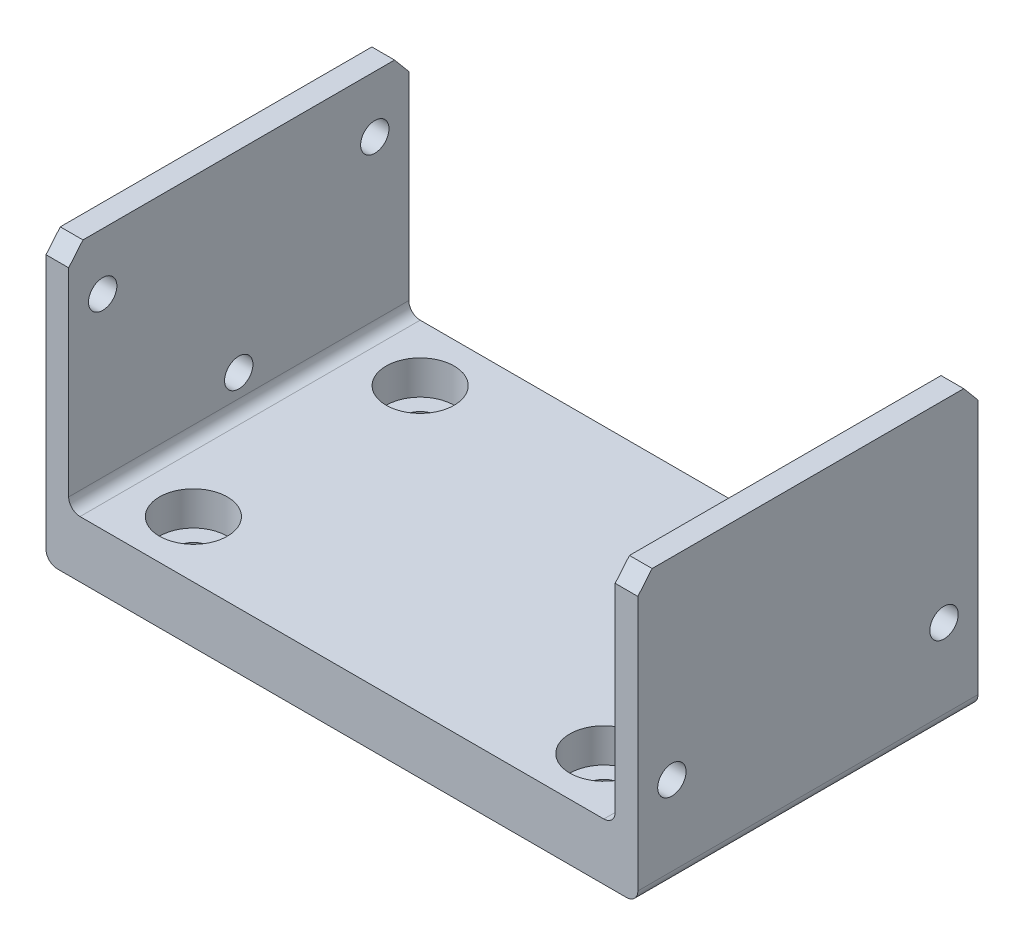
ISO-10303-21;
HEADER;
FILE_DESCRIPTION(('STEP AP214'),'2;1');
FILE_NAME('part.step','',(''),(''),'','','');
FILE_SCHEMA(('AUTOMOTIVE_DESIGN { 1 0 10303 214 1 1 1 1 }'));
ENDSEC;
DATA;
#1=APPLICATION_CONTEXT('core data for automotive mechanical design processes');
#2=APPLICATION_PROTOCOL_DEFINITION('international standard','automotive_design',2000,#1);
#3=PRODUCT_CONTEXT('',#1,'mechanical');
#4=PRODUCT('Part','Part','',(#3));
#5=PRODUCT_RELATED_PRODUCT_CATEGORY('part','',(#4));
#6=PRODUCT_DEFINITION_FORMATION('','',#4);
#7=PRODUCT_DEFINITION_CONTEXT('part definition',#1,'design');
#8=PRODUCT_DEFINITION('design','',#6,#7);
#9=PRODUCT_DEFINITION_SHAPE('','',#8);
#10=(LENGTH_UNIT() NAMED_UNIT(*) SI_UNIT(.MILLI.,.METRE.));
#11=(NAMED_UNIT(*) PLANE_ANGLE_UNIT() SI_UNIT($,.RADIAN.));
#12=(NAMED_UNIT(*) SI_UNIT($,.STERADIAN.) SOLID_ANGLE_UNIT());
#13=UNCERTAINTY_MEASURE_WITH_UNIT(LENGTH_MEASURE(1.E-05),#10,'distance_accuracy_value','');
#14=(GEOMETRIC_REPRESENTATION_CONTEXT(3) GLOBAL_UNCERTAINTY_ASSIGNED_CONTEXT((#13)) GLOBAL_UNIT_ASSIGNED_CONTEXT((#10,
#11,#12)) REPRESENTATION_CONTEXT('',''));
#15=CARTESIAN_POINT('',(0.,0.,0.));
#16=DIRECTION('',(0.,0.,1.));
#17=DIRECTION('',(1.,0.,0.));
#18=AXIS2_PLACEMENT_3D('',#15,#16,#17);
#19=CARTESIAN_POINT('',(0.,3.,0.));
#20=DIRECTION('',(0.,-1.,0.));
#21=DIRECTION('',(0.,0.,-1.));
#22=AXIS2_PLACEMENT_3D('',#19,#20,#21);
#23=PLANE('',#22);
#24=CARTESIAN_POINT('',(-18.1,3.,10.));
#25=DIRECTION('',(0.,1.,0.));
#26=DIRECTION('',(0.,0.,1.));
#27=AXIS2_PLACEMENT_3D('',#24,#25,#26);
#28=CIRCLE('',#27,3.);
#29=CARTESIAN_POINT('',(-18.1,3.,13.));
#30=VERTEX_POINT('',#29);
#31=EDGE_CURVE('E329',#30,#30,#28,.T.);
#32=ORIENTED_EDGE('',*,*,#31,.F.);
#33=EDGE_LOOP('',(#32));
#34=FACE_BOUND('',#33,.T.);
#35=CARTESIAN_POINT('',(18.1,3.,-10.));
#36=DIRECTION('',(0.,1.,0.));
#37=DIRECTION('',(0.,0.,1.));
#38=AXIS2_PLACEMENT_3D('',#35,#36,#37);
#39=CIRCLE('',#38,3.);
#40=CARTESIAN_POINT('',(18.1,3.,-6.99999999999999));
#41=VERTEX_POINT('',#40);
#42=EDGE_CURVE('E335',#41,#41,#39,.T.);
#43=ORIENTED_EDGE('',*,*,#42,.F.);
#44=EDGE_LOOP('',(#43));
#45=FACE_BOUND('',#44,.T.);
#46=CARTESIAN_POINT('',(18.1,3.,10.));
#47=DIRECTION('',(0.,1.,0.));
#48=DIRECTION('',(0.,0.,1.));
#49=AXIS2_PLACEMENT_3D('',#46,#47,#48);
#50=CIRCLE('',#49,3.);
#51=CARTESIAN_POINT('',(18.1,3.,13.));
#52=VERTEX_POINT('',#51);
#53=EDGE_CURVE('E336',#52,#52,#50,.T.);
#54=ORIENTED_EDGE('',*,*,#53,.F.);
#55=EDGE_LOOP('',(#54));
#56=FACE_BOUND('',#55,.T.);
#57=CARTESIAN_POINT('',(-18.1,3.,-10.));
#58=DIRECTION('',(0.,1.,0.));
#59=DIRECTION('',(0.,0.,1.));
#60=AXIS2_PLACEMENT_3D('',#57,#58,#59);
#61=CIRCLE('',#60,3.);
#62=CARTESIAN_POINT('',(-18.1,3.,-7.));
#63=VERTEX_POINT('',#62);
#64=EDGE_CURVE('E326',#63,#63,#61,.T.);
#65=ORIENTED_EDGE('',*,*,#64,.F.);
#66=EDGE_LOOP('',(#65));
#67=FACE_BOUND('',#66,.T.);
#68=DIRECTION('',(-1.,0.,0.));
#69=VECTOR('',#68,1.);
#70=CARTESIAN_POINT('',(-26.1,3.,-15.));
#71=LINE('',#70,#69);
#72=CARTESIAN_POINT('',(23.1,3.,-15.));
#73=VERTEX_POINT('',#72);
#74=CARTESIAN_POINT('',(-23.1,3.,-15.));
#75=VERTEX_POINT('',#74);
#76=EDGE_CURVE('E290',#73,#75,#71,.T.);
#77=ORIENTED_EDGE('',*,*,#76,.T.);
#78=DIRECTION('',(0.,0.,-1.));
#79=VECTOR('',#78,1.);
#80=CARTESIAN_POINT('',(-23.1,3.,15.));
#81=LINE('',#80,#79);
#82=CARTESIAN_POINT('',(-23.1,3.,15.));
#83=VERTEX_POINT('',#82);
#84=EDGE_CURVE('E178',#75,#83,#81,.F.);
#85=ORIENTED_EDGE('',*,*,#84,.T.);
#86=DIRECTION('',(1.,0.,0.));
#87=VECTOR('',#86,1.);
#88=CARTESIAN_POINT('',(-26.1,3.,15.));
#89=LINE('',#88,#87);
#90=CARTESIAN_POINT('',(23.1,3.,15.));
#91=VERTEX_POINT('',#90);
#92=EDGE_CURVE('E287',#83,#91,#89,.T.);
#93=ORIENTED_EDGE('',*,*,#92,.T.);
#94=DIRECTION('',(0.,0.,1.));
#95=VECTOR('',#94,1.);
#96=CARTESIAN_POINT('',(23.1,3.,-15.));
#97=LINE('',#96,#95);
#98=EDGE_CURVE('E186',#91,#73,#97,.F.);
#99=ORIENTED_EDGE('',*,*,#98,.T.);
#100=EDGE_LOOP('',(#77,#85,#93,#99));
#101=FACE_BOUND('',#100,.T.);
#102=ADVANCED_FACE('F42',(#34,#45,#56,#67,#101),#23,.F.);
#103=CARTESIAN_POINT('',(-26.1,3.,15.));
#104=DIRECTION('',(1.,0.,0.));
#105=DIRECTION('',(0.,0.,-1.));
#106=AXIS2_PLACEMENT_3D('',#103,#104,#105);
#107=PLANE('',#106);
#108=CARTESIAN_POINT('',(-26.1,18.0000000000057,12.0000000202131));
#109=DIRECTION('',(1.,0.,0.));
#110=DIRECTION('',(0.,0.,-1.));
#111=AXIS2_PLACEMENT_3D('',#108,#109,#110);
#112=CIRCLE('',#111,1.24999999998781);
#113=CARTESIAN_POINT('',(-26.1,18.0000000000057,10.7500000202253));
#114=VERTEX_POINT('',#113);
#115=EDGE_CURVE('E306',#114,#114,#112,.T.);
#116=ORIENTED_EDGE('',*,*,#115,.T.);
#117=EDGE_LOOP('',(#116));
#118=FACE_BOUND('',#117,.T.);
#119=CARTESIAN_POINT('',(-26.1,18.0000000000057,-12.0000000202347));
#120=DIRECTION('',(1.,0.,0.));
#121=DIRECTION('',(0.,0.,-1.));
#122=AXIS2_PLACEMENT_3D('',#119,#120,#121);
#123=CIRCLE('',#122,1.24999999998782);
#124=CARTESIAN_POINT('',(-26.1,18.0000000000057,-13.2500000202226));
#125=VERTEX_POINT('',#124);
#126=EDGE_CURVE('E310',#125,#125,#123,.T.);
#127=ORIENTED_EDGE('',*,*,#126,.T.);
#128=EDGE_LOOP('',(#127));
#129=FACE_BOUND('',#128,.T.);
#130=CARTESIAN_POINT('',(-26.1,6.00000000000578,-1.09389370165124E-11));
#131=DIRECTION('',(1.,0.,0.));
#132=DIRECTION('',(0.,0.,-1.));
#133=AXIS2_PLACEMENT_3D('',#130,#131,#132);
#134=CIRCLE('',#133,1.24999999407489);
#135=CARTESIAN_POINT('',(-26.1,6.00000000000578,-1.24999999408583));
#136=VERTEX_POINT('',#135);
#137=EDGE_CURVE('E313',#136,#136,#134,.T.);
#138=ORIENTED_EDGE('',*,*,#137,.T.);
#139=EDGE_LOOP('',(#138));
#140=FACE_BOUND('',#139,.T.);
#141=DIRECTION('',(0.,-1.,0.));
#142=VECTOR('',#141,1.);
#143=CARTESIAN_POINT('',(-26.1,3.,15.));
#144=LINE('',#143,#142);
#145=CARTESIAN_POINT('',(-26.1,21.5,15.));
#146=VERTEX_POINT('',#145);
#147=CARTESIAN_POINT('',(-26.1,-1.,15.));
#148=VERTEX_POINT('',#147);
#149=EDGE_CURVE('E187',#146,#148,#144,.T.);
#150=ORIENTED_EDGE('',*,*,#149,.F.);
#151=DIRECTION('',(0.,-0.766044443118979,0.642787609686539));
#152=VECTOR('',#151,1.);
#153=CARTESIAN_POINT('',(-26.1,23.,13.7413505532341));
#154=LINE('',#153,#152);
#155=CARTESIAN_POINT('',(-26.1,23.,13.7413505532341));
#156=VERTEX_POINT('',#155);
#157=EDGE_CURVE('E243',#146,#156,#154,.F.);
#158=ORIENTED_EDGE('',*,*,#157,.T.);
#159=DIRECTION('',(0.,0.,1.));
#160=VECTOR('',#159,1.);
#161=CARTESIAN_POINT('',(-26.1,23.,15.));
#162=LINE('',#161,#160);
#163=CARTESIAN_POINT('',(-26.1,23.,-13.7413505532341));
#164=VERTEX_POINT('',#163);
#165=EDGE_CURVE('E281',#164,#156,#162,.T.);
#166=ORIENTED_EDGE('',*,*,#165,.F.);
#167=DIRECTION('',(0.,0.766044443118979,0.642787609686539));
#168=VECTOR('',#167,1.);
#169=CARTESIAN_POINT('',(-26.1,23.,-13.7413505532341));
#170=LINE('',#169,#168);
#171=CARTESIAN_POINT('',(-26.1,21.5,-15.));
#172=VERTEX_POINT('',#171);
#173=EDGE_CURVE('E241',#164,#172,#170,.F.);
#174=ORIENTED_EDGE('',*,*,#173,.T.);
#175=DIRECTION('',(0.,-1.,0.));
#176=VECTOR('',#175,1.);
#177=CARTESIAN_POINT('',(-26.1,3.,-15.));
#178=LINE('',#177,#176);
#179=CARTESIAN_POINT('',(-26.1,-1.,-15.));
#180=VERTEX_POINT('',#179);
#181=EDGE_CURVE('E292',#172,#180,#178,.T.);
#182=ORIENTED_EDGE('',*,*,#181,.T.);
#183=DIRECTION('',(0.,0.,-1.));
#184=VECTOR('',#183,1.);
#185=CARTESIAN_POINT('',(-26.1,-1.,15.));
#186=LINE('',#185,#184);
#187=EDGE_CURVE('E180',#180,#148,#186,.F.);
#188=ORIENTED_EDGE('',*,*,#187,.T.);
#189=EDGE_LOOP('',(#150,#158,#166,#174,#182,#188));
#190=FACE_BOUND('',#189,.T.);
#191=ADVANCED_FACE('F400',(#118,#129,#140,#190),#107,.F.);
#192=CARTESIAN_POINT('',(-26.1,3.,15.));
#193=DIRECTION('',(0.,0.,-1.));
#194=DIRECTION('',(-1.,0.,0.));
#195=AXIS2_PLACEMENT_3D('',#192,#193,#194);
#196=PLANE('',#195);
#197=DIRECTION('',(0.,-1.,0.));
#198=VECTOR('',#197,1.);
#199=CARTESIAN_POINT('',(-24.1,23.,15.));
#200=LINE('',#199,#198);
#201=CARTESIAN_POINT('',(-24.1,21.5,15.));
#202=VERTEX_POINT('',#201);
#203=CARTESIAN_POINT('',(-24.1,4.,15.));
#204=VERTEX_POINT('',#203);
#205=EDGE_CURVE('E169',#202,#204,#200,.T.);
#206=ORIENTED_EDGE('',*,*,#205,.F.);
#207=DIRECTION('',(-1.,0.,0.));
#208=VECTOR('',#207,1.);
#209=CARTESIAN_POINT('',(-26.1,21.5,15.));
#210=LINE('',#209,#208);
#211=EDGE_CURVE('E239',#202,#146,#210,.T.);
#212=ORIENTED_EDGE('',*,*,#211,.T.);
#213=ORIENTED_EDGE('',*,*,#149,.T.);
#214=CARTESIAN_POINT('',(-25.1,-1.,15.));
#215=DIRECTION('',(0.,0.,-1.));
#216=DIRECTION('',(-1.,0.,0.));
#217=AXIS2_PLACEMENT_3D('',#214,#215,#216);
#218=CIRCLE('',#217,1.);
#219=CARTESIAN_POINT('',(-25.1,-2.,15.));
#220=VERTEX_POINT('',#219);
#221=EDGE_CURVE('E206',#148,#220,#218,.F.);
#222=ORIENTED_EDGE('',*,*,#221,.T.);
#223=DIRECTION('',(-1.,0.,0.));
#224=VECTOR('',#223,1.);
#225=CARTESIAN_POINT('',(-26.1,-2.,15.));
#226=LINE('',#225,#224);
#227=CARTESIAN_POINT('',(25.1,-2.,15.));
#228=VERTEX_POINT('',#227);
#229=EDGE_CURVE('E347',#228,#220,#226,.T.);
#230=ORIENTED_EDGE('',*,*,#229,.F.);
#231=CARTESIAN_POINT('',(25.1,-1.,15.));
#232=DIRECTION('',(0.,0.,-1.));
#233=DIRECTION('',(-1.,0.,0.));
#234=AXIS2_PLACEMENT_3D('',#231,#232,#233);
#235=CIRCLE('',#234,1.);
#236=CARTESIAN_POINT('',(26.1,-1.,15.));
#237=VERTEX_POINT('',#236);
#238=EDGE_CURVE('E208',#228,#237,#235,.F.);
#239=ORIENTED_EDGE('',*,*,#238,.T.);
#240=DIRECTION('',(0.,-1.,0.));
#241=VECTOR('',#240,1.);
#242=CARTESIAN_POINT('',(26.1,3.,15.));
#243=LINE('',#242,#241);
#244=CARTESIAN_POINT('',(26.1,21.5,15.));
#245=VERTEX_POINT('',#244);
#246=EDGE_CURVE('E190',#245,#237,#243,.T.);
#247=ORIENTED_EDGE('',*,*,#246,.F.);
#248=DIRECTION('',(-1.,0.,0.));
#249=VECTOR('',#248,1.);
#250=CARTESIAN_POINT('',(24.1,21.5,15.));
#251=LINE('',#250,#249);
#252=CARTESIAN_POINT('',(24.1,21.5,15.));
#253=VERTEX_POINT('',#252);
#254=EDGE_CURVE('E237',#245,#253,#251,.T.);
#255=ORIENTED_EDGE('',*,*,#254,.T.);
#256=DIRECTION('',(0.,-1.,0.));
#257=VECTOR('',#256,1.);
#258=CARTESIAN_POINT('',(24.1,23.,15.));
#259=LINE('',#258,#257);
#260=CARTESIAN_POINT('',(24.1,4.,15.));
#261=VERTEX_POINT('',#260);
#262=EDGE_CURVE('E273',#253,#261,#259,.T.);
#263=ORIENTED_EDGE('',*,*,#262,.T.);
#264=CARTESIAN_POINT('',(23.1,4.,15.));
#265=DIRECTION('',(0.,0.,-1.));
#266=DIRECTION('',(-1.,0.,0.));
#267=AXIS2_PLACEMENT_3D('',#264,#265,#266);
#268=CIRCLE('',#267,1.);
#269=EDGE_CURVE('E222',#261,#91,#268,.T.);
#270=ORIENTED_EDGE('',*,*,#269,.T.);
#271=ORIENTED_EDGE('',*,*,#92,.F.);
#272=CARTESIAN_POINT('',(-23.1,4.,15.));
#273=DIRECTION('',(0.,0.,-1.));
#274=DIRECTION('',(-1.,0.,0.));
#275=AXIS2_PLACEMENT_3D('',#272,#273,#274);
#276=CIRCLE('',#275,1.);
#277=EDGE_CURVE('E179',#83,#204,#276,.T.);
#278=ORIENTED_EDGE('',*,*,#277,.T.);
#279=EDGE_LOOP('',(#206,#212,#213,#222,#230,#239,#247,#255,#263,#270,#271,#278));
#280=FACE_BOUND('',#279,.T.);
#281=ADVANCED_FACE('F265',(#280),#196,.F.);
#282=CARTESIAN_POINT('',(26.1,3.,15.));
#283=DIRECTION('',(-1.,0.,0.));
#284=DIRECTION('',(0.,0.,1.));
#285=AXIS2_PLACEMENT_3D('',#282,#283,#284);
#286=PLANE('',#285);
#287=CARTESIAN_POINT('',(26.1,6.00000000000651,-12.000000000011));
#288=DIRECTION('',(1.,0.,0.));
#289=DIRECTION('',(0.,0.,-1.));
#290=AXIS2_PLACEMENT_3D('',#287,#288,#289);
#291=CIRCLE('',#290,1.25261137645109);
#292=CARTESIAN_POINT('',(26.1,6.00000000000651,-13.2526113764621));
#293=VERTEX_POINT('',#292);
#294=EDGE_CURVE('E296',#293,#293,#291,.T.);
#295=ORIENTED_EDGE('',*,*,#294,.F.);
#296=EDGE_LOOP('',(#295));
#297=FACE_BOUND('',#296,.T.);
#298=CARTESIAN_POINT('',(26.1,6.00000000000651,11.999999999989));
#299=DIRECTION('',(1.,0.,0.));
#300=DIRECTION('',(0.,0.,-1.));
#301=AXIS2_PLACEMENT_3D('',#298,#299,#300);
#302=CIRCLE('',#301,1.2502084869955);
#303=CARTESIAN_POINT('',(26.1,6.00000000000651,10.7497915129935));
#304=VERTEX_POINT('',#303);
#305=EDGE_CURVE('E301',#304,#304,#302,.T.);
#306=ORIENTED_EDGE('',*,*,#305,.F.);
#307=EDGE_LOOP('',(#306));
#308=FACE_BOUND('',#307,.T.);
#309=DIRECTION('',(0.,-1.,0.));
#310=VECTOR('',#309,1.);
#311=CARTESIAN_POINT('',(26.1,3.,-15.));
#312=LINE('',#311,#310);
#313=CARTESIAN_POINT('',(26.1,21.5,-15.));
#314=VERTEX_POINT('',#313);
#315=CARTESIAN_POINT('',(26.1,-1.,-15.));
#316=VERTEX_POINT('',#315);
#317=EDGE_CURVE('E268',#314,#316,#312,.T.);
#318=ORIENTED_EDGE('',*,*,#317,.F.);
#319=DIRECTION('',(0.,0.766044443118979,0.642787609686539));
#320=VECTOR('',#319,1.);
#321=CARTESIAN_POINT('',(26.1,23.,-13.7413505532341));
#322=LINE('',#321,#320);
#323=CARTESIAN_POINT('',(26.1,23.,-13.7413505532341));
#324=VERTEX_POINT('',#323);
#325=EDGE_CURVE('E11',#314,#324,#322,.T.);
#326=ORIENTED_EDGE('',*,*,#325,.T.);
#327=DIRECTION('',(0.,0.,-1.));
#328=VECTOR('',#327,1.);
#329=CARTESIAN_POINT('',(26.1,23.,15.));
#330=LINE('',#329,#328);
#331=CARTESIAN_POINT('',(26.1,23.,13.7413505532341));
#332=VERTEX_POINT('',#331);
#333=EDGE_CURVE('E260',#332,#324,#330,.T.);
#334=ORIENTED_EDGE('',*,*,#333,.F.);
#335=DIRECTION('',(0.,-0.766044443118979,0.642787609686539));
#336=VECTOR('',#335,1.);
#337=CARTESIAN_POINT('',(26.1,23.,13.7413505532341));
#338=LINE('',#337,#336);
#339=EDGE_CURVE('E51',#332,#245,#338,.T.);
#340=ORIENTED_EDGE('',*,*,#339,.T.);
#341=ORIENTED_EDGE('',*,*,#246,.T.);
#342=DIRECTION('',(0.,0.,1.));
#343=VECTOR('',#342,1.);
#344=CARTESIAN_POINT('',(26.1,-1.,15.));
#345=LINE('',#344,#343);
#346=EDGE_CURVE('E211',#237,#316,#345,.F.);
#347=ORIENTED_EDGE('',*,*,#346,.T.);
#348=EDGE_LOOP('',(#318,#326,#334,#340,#341,#347));
#349=FACE_BOUND('',#348,.T.);
#350=ADVANCED_FACE('F258',(#297,#308,#349),#286,.F.);
#351=CARTESIAN_POINT('',(-26.1,3.,-15.));
#352=DIRECTION('',(0.,0.,1.));
#353=DIRECTION('',(1.,0.,0.));
#354=AXIS2_PLACEMENT_3D('',#351,#352,#353);
#355=PLANE('',#354);
#356=ORIENTED_EDGE('',*,*,#181,.F.);
#357=DIRECTION('',(1.,0.,0.));
#358=VECTOR('',#357,1.);
#359=CARTESIAN_POINT('',(-26.1,21.5,-15.));
#360=LINE('',#359,#358);
#361=CARTESIAN_POINT('',(-24.1,21.5,-15.));
#362=VERTEX_POINT('',#361);
#363=EDGE_CURVE('E165',#172,#362,#360,.T.);
#364=ORIENTED_EDGE('',*,*,#363,.T.);
#365=DIRECTION('',(0.,-1.,0.));
#366=VECTOR('',#365,1.);
#367=CARTESIAN_POINT('',(-24.1,23.,-15.));
#368=LINE('',#367,#366);
#369=CARTESIAN_POINT('',(-24.1,4.,-15.));
#370=VERTEX_POINT('',#369);
#371=EDGE_CURVE('E157',#362,#370,#368,.T.);
#372=ORIENTED_EDGE('',*,*,#371,.T.);
#373=CARTESIAN_POINT('',(-23.1,4.,-15.));
#374=DIRECTION('',(0.,0.,1.));
#375=DIRECTION('',(1.,0.,0.));
#376=AXIS2_PLACEMENT_3D('',#373,#374,#375);
#377=CIRCLE('',#376,1.);
#378=EDGE_CURVE('E162',#370,#75,#377,.T.);
#379=ORIENTED_EDGE('',*,*,#378,.T.);
#380=ORIENTED_EDGE('',*,*,#76,.F.);
#381=CARTESIAN_POINT('',(23.1,4.,-15.));
#382=DIRECTION('',(0.,0.,1.));
#383=DIRECTION('',(1.,0.,0.));
#384=AXIS2_PLACEMENT_3D('',#381,#382,#383);
#385=CIRCLE('',#384,1.);
#386=CARTESIAN_POINT('',(24.1,4.,-15.));
#387=VERTEX_POINT('',#386);
#388=EDGE_CURVE('E224',#73,#387,#385,.T.);
#389=ORIENTED_EDGE('',*,*,#388,.T.);
#390=DIRECTION('',(0.,-1.,0.));
#391=VECTOR('',#390,1.);
#392=CARTESIAN_POINT('',(24.1,23.,-15.));
#393=LINE('',#392,#391);
#394=CARTESIAN_POINT('',(24.1,21.5,-15.));
#395=VERTEX_POINT('',#394);
#396=EDGE_CURVE('E275',#395,#387,#393,.T.);
#397=ORIENTED_EDGE('',*,*,#396,.F.);
#398=DIRECTION('',(1.,0.,0.));
#399=VECTOR('',#398,1.);
#400=CARTESIAN_POINT('',(26.1,21.5,-15.));
#401=LINE('',#400,#399);
#402=EDGE_CURVE('E245',#395,#314,#401,.T.);
#403=ORIENTED_EDGE('',*,*,#402,.T.);
#404=ORIENTED_EDGE('',*,*,#317,.T.);
#405=CARTESIAN_POINT('',(25.1,-1.,-15.));
#406=DIRECTION('',(0.,0.,1.));
#407=DIRECTION('',(1.,0.,0.));
#408=AXIS2_PLACEMENT_3D('',#405,#406,#407);
#409=CIRCLE('',#408,1.);
#410=CARTESIAN_POINT('',(25.1,-2.,-15.));
#411=VERTEX_POINT('',#410);
#412=EDGE_CURVE('E217',#316,#411,#409,.F.);
#413=ORIENTED_EDGE('',*,*,#412,.T.);
#414=DIRECTION('',(1.,0.,0.));
#415=VECTOR('',#414,1.);
#416=CARTESIAN_POINT('',(-26.1,-2.,-15.));
#417=LINE('',#416,#415);
#418=CARTESIAN_POINT('',(-25.1,-2.,-15.));
#419=VERTEX_POINT('',#418);
#420=EDGE_CURVE('E352',#419,#411,#417,.T.);
#421=ORIENTED_EDGE('',*,*,#420,.F.);
#422=CARTESIAN_POINT('',(-25.1,-1.,-15.));
#423=DIRECTION('',(0.,0.,1.));
#424=DIRECTION('',(1.,0.,0.));
#425=AXIS2_PLACEMENT_3D('',#422,#423,#424);
#426=CIRCLE('',#425,1.);
#427=EDGE_CURVE('E214',#419,#180,#426,.F.);
#428=ORIENTED_EDGE('',*,*,#427,.T.);
#429=EDGE_LOOP('',(#356,#364,#372,#379,#380,#389,#397,#403,#404,#413,#421,#428));
#430=FACE_BOUND('',#429,.T.);
#431=ADVANCED_FACE('F160',(#430),#355,.F.);
#432=CARTESIAN_POINT('',(-24.1,23.,15.));
#433=DIRECTION('',(-1.,0.,0.));
#434=DIRECTION('',(0.,0.,1.));
#435=AXIS2_PLACEMENT_3D('',#432,#433,#434);
#436=PLANE('',#435);
#437=CARTESIAN_POINT('',(-24.1,18.0000000000057,12.0000000202131));
#438=DIRECTION('',(1.,0.,0.));
#439=DIRECTION('',(0.,0.,-1.));
#440=AXIS2_PLACEMENT_3D('',#437,#438,#439);
#441=CIRCLE('',#440,1.24999999998781);
#442=CARTESIAN_POINT('',(-24.1,18.0000000000057,10.7500000202253));
#443=VERTEX_POINT('',#442);
#444=EDGE_CURVE('E316',#443,#443,#441,.T.);
#445=ORIENTED_EDGE('',*,*,#444,.F.);
#446=EDGE_LOOP('',(#445));
#447=FACE_BOUND('',#446,.T.);
#448=CARTESIAN_POINT('',(-24.1,18.0000000000057,-12.0000000202347));
#449=DIRECTION('',(1.,0.,0.));
#450=DIRECTION('',(0.,0.,-1.));
#451=AXIS2_PLACEMENT_3D('',#448,#449,#450);
#452=CIRCLE('',#451,1.24999999998782);
#453=CARTESIAN_POINT('',(-24.1,18.0000000000057,-13.2500000202226));
#454=VERTEX_POINT('',#453);
#455=EDGE_CURVE('E320',#454,#454,#452,.T.);
#456=ORIENTED_EDGE('',*,*,#455,.F.);
#457=EDGE_LOOP('',(#456));
#458=FACE_BOUND('',#457,.T.);
#459=CARTESIAN_POINT('',(-24.1,6.00000000000578,-1.09389370165124E-11));
#460=DIRECTION('',(1.,0.,0.));
#461=DIRECTION('',(0.,0.,-1.));
#462=AXIS2_PLACEMENT_3D('',#459,#460,#461);
#463=CIRCLE('',#462,1.24999999407489);
#464=CARTESIAN_POINT('',(-24.1,6.00000000000578,-1.24999999408583));
#465=VERTEX_POINT('',#464);
#466=EDGE_CURVE('E317',#465,#465,#463,.T.);
#467=ORIENTED_EDGE('',*,*,#466,.F.);
#468=EDGE_LOOP('',(#467));
#469=FACE_BOUND('',#468,.T.);
#470=DIRECTION('',(0.,0.,-1.));
#471=VECTOR('',#470,1.);
#472=CARTESIAN_POINT('',(-24.1,23.,15.));
#473=LINE('',#472,#471);
#474=CARTESIAN_POINT('',(-24.1,23.,13.7413505532341));
#475=VERTEX_POINT('',#474);
#476=CARTESIAN_POINT('',(-24.1,23.,-13.7413505532341));
#477=VERTEX_POINT('',#476);
#478=EDGE_CURVE('E170',#475,#477,#473,.T.);
#479=ORIENTED_EDGE('',*,*,#478,.F.);
#480=DIRECTION('',(0.,0.766044443118979,-0.642787609686539));
#481=VECTOR('',#480,1.);
#482=CARTESIAN_POINT('',(-24.1,23.,13.7413505532341));
#483=LINE('',#482,#481);
#484=EDGE_CURVE('E235',#475,#202,#483,.F.);
#485=ORIENTED_EDGE('',*,*,#484,.T.);
#486=ORIENTED_EDGE('',*,*,#205,.T.);
#487=DIRECTION('',(0.,0.,-1.));
#488=VECTOR('',#487,1.);
#489=CARTESIAN_POINT('',(-24.1,4.,-15.));
#490=LINE('',#489,#488);
#491=EDGE_CURVE('E177',#204,#370,#490,.T.);
#492=ORIENTED_EDGE('',*,*,#491,.T.);
#493=ORIENTED_EDGE('',*,*,#371,.F.);
#494=DIRECTION('',(0.,-0.766044443118979,-0.642787609686539));
#495=VECTOR('',#494,1.);
#496=CARTESIAN_POINT('',(-24.1,23.,-13.7413505532341));
#497=LINE('',#496,#495);
#498=EDGE_CURVE('E233',#362,#477,#497,.F.);
#499=ORIENTED_EDGE('',*,*,#498,.T.);
#500=EDGE_LOOP('',(#479,#485,#486,#492,#493,#499));
#501=FACE_BOUND('',#500,.T.);
#502=ADVANCED_FACE('F183',(#447,#458,#469,#501),#436,.F.);
#503=CARTESIAN_POINT('',(0.,23.,0.));
#504=DIRECTION('',(0.,-1.,0.));
#505=DIRECTION('',(0.,0.,-1.));
#506=AXIS2_PLACEMENT_3D('',#503,#504,#505);
#507=PLANE('',#506);
#508=ORIENTED_EDGE('',*,*,#165,.T.);
#509=DIRECTION('',(1.,0.,0.));
#510=VECTOR('',#509,1.);
#511=CARTESIAN_POINT('',(0.,23.,13.7413505532341));
#512=LINE('',#511,#510);
#513=EDGE_CURVE('E230',#156,#475,#512,.T.);
#514=ORIENTED_EDGE('',*,*,#513,.T.);
#515=ORIENTED_EDGE('',*,*,#478,.T.);
#516=DIRECTION('',(-1.,0.,0.));
#517=VECTOR('',#516,1.);
#518=CARTESIAN_POINT('',(0.,23.,-13.7413505532341));
#519=LINE('',#518,#517);
#520=EDGE_CURVE('E227',#477,#164,#519,.T.);
#521=ORIENTED_EDGE('',*,*,#520,.T.);
#522=EDGE_LOOP('',(#508,#514,#515,#521));
#523=FACE_BOUND('',#522,.T.);
#524=ADVANCED_FACE('F680',(#523),#507,.F.);
#525=CARTESIAN_POINT('',(24.1,23.,15.));
#526=DIRECTION('',(1.,0.,0.));
#527=DIRECTION('',(0.,0.,-1.));
#528=AXIS2_PLACEMENT_3D('',#525,#526,#527);
#529=PLANE('',#528);
#530=CARTESIAN_POINT('',(24.1,6.00000000000651,-12.000000000011));
#531=DIRECTION('',(1.,0.,0.));
#532=DIRECTION('',(0.,0.,-1.));
#533=AXIS2_PLACEMENT_3D('',#530,#531,#532);
#534=CIRCLE('',#533,1.25261137645109);
#535=CARTESIAN_POINT('',(24.1,6.00000000000651,-13.2526113764621));
#536=VERTEX_POINT('',#535);
#537=EDGE_CURVE('E193',#536,#536,#534,.T.);
#538=ORIENTED_EDGE('',*,*,#537,.T.);
#539=EDGE_LOOP('',(#538));
#540=FACE_BOUND('',#539,.T.);
#541=CARTESIAN_POINT('',(24.1,6.00000000000651,11.999999999989));
#542=DIRECTION('',(1.,0.,0.));
#543=DIRECTION('',(0.,0.,-1.));
#544=AXIS2_PLACEMENT_3D('',#541,#542,#543);
#545=CIRCLE('',#544,1.2502084869955);
#546=CARTESIAN_POINT('',(24.1,6.00000000000651,10.7497915129935));
#547=VERTEX_POINT('',#546);
#548=EDGE_CURVE('E294',#547,#547,#545,.T.);
#549=ORIENTED_EDGE('',*,*,#548,.T.);
#550=EDGE_LOOP('',(#549));
#551=FACE_BOUND('',#550,.T.);
#552=DIRECTION('',(0.,0.,1.));
#553=VECTOR('',#552,1.);
#554=CARTESIAN_POINT('',(24.1,23.,15.));
#555=LINE('',#554,#553);
#556=CARTESIAN_POINT('',(24.1,23.,-13.7413505532341));
#557=VERTEX_POINT('',#556);
#558=CARTESIAN_POINT('',(24.1,23.,13.7413505532341));
#559=VERTEX_POINT('',#558);
#560=EDGE_CURVE('E272',#557,#559,#555,.T.);
#561=ORIENTED_EDGE('',*,*,#560,.F.);
#562=DIRECTION('',(0.,-0.766044443118979,-0.642787609686539));
#563=VECTOR('',#562,1.);
#564=CARTESIAN_POINT('',(24.1,23.,-13.7413505532341));
#565=LINE('',#564,#563);
#566=EDGE_CURVE('E66',#557,#395,#565,.T.);
#567=ORIENTED_EDGE('',*,*,#566,.T.);
#568=ORIENTED_EDGE('',*,*,#396,.T.);
#569=DIRECTION('',(0.,0.,1.));
#570=VECTOR('',#569,1.);
#571=CARTESIAN_POINT('',(24.1,4.,15.));
#572=LINE('',#571,#570);
#573=EDGE_CURVE('E197',#387,#261,#572,.T.);
#574=ORIENTED_EDGE('',*,*,#573,.T.);
#575=ORIENTED_EDGE('',*,*,#262,.F.);
#576=DIRECTION('',(0.,0.766044443118979,-0.642787609686539));
#577=VECTOR('',#576,1.);
#578=CARTESIAN_POINT('',(24.1,23.,13.7413505532341));
#579=LINE('',#578,#577);
#580=EDGE_CURVE('E58',#253,#559,#579,.T.);
#581=ORIENTED_EDGE('',*,*,#580,.T.);
#582=EDGE_LOOP('',(#561,#567,#568,#574,#575,#581));
#583=FACE_BOUND('',#582,.T.);
#584=ADVANCED_FACE('F415',(#540,#551,#583),#529,.F.);
#585=CARTESIAN_POINT('',(0.,23.,0.));
#586=DIRECTION('',(0.,1.,0.));
#587=DIRECTION('',(0.,0.,1.));
#588=AXIS2_PLACEMENT_3D('',#585,#586,#587);
#589=PLANE('',#588);
#590=ORIENTED_EDGE('',*,*,#333,.T.);
#591=DIRECTION('',(-1.,0.,0.));
#592=VECTOR('',#591,1.);
#593=CARTESIAN_POINT('',(24.1,23.,-13.7413505532341));
#594=LINE('',#593,#592);
#595=EDGE_CURVE('E251',#324,#557,#594,.T.);
#596=ORIENTED_EDGE('',*,*,#595,.T.);
#597=ORIENTED_EDGE('',*,*,#560,.T.);
#598=DIRECTION('',(1.,0.,0.));
#599=VECTOR('',#598,1.);
#600=CARTESIAN_POINT('',(26.1,23.,13.7413505532341));
#601=LINE('',#600,#599);
#602=EDGE_CURVE('E248',#559,#332,#601,.T.);
#603=ORIENTED_EDGE('',*,*,#602,.T.);
#604=EDGE_LOOP('',(#590,#596,#597,#603));
#605=FACE_BOUND('',#604,.T.);
#606=ADVANCED_FACE('F271',(#605),#589,.T.);
#607=CARTESIAN_POINT('',(21.1,6.00000000000651,11.999999999989));
#608=DIRECTION('',(1.,0.,0.));
#609=DIRECTION('',(0.,0.,-1.));
#610=AXIS2_PLACEMENT_3D('',#607,#608,#609);
#611=CYLINDRICAL_SURFACE('',#610,1.2502084869955);
#612=ORIENTED_EDGE('',*,*,#305,.T.);
#613=EDGE_LOOP('',(#612));
#614=FACE_BOUND('',#613,.T.);
#615=ORIENTED_EDGE('',*,*,#548,.F.);
#616=EDGE_LOOP('',(#615));
#617=FACE_BOUND('',#616,.T.);
#618=ADVANCED_FACE('F655',(#614,#617),#611,.F.);
#619=CARTESIAN_POINT('',(21.1,6.00000000000651,-12.000000000011));
#620=DIRECTION('',(1.,0.,0.));
#621=DIRECTION('',(0.,0.,-1.));
#622=AXIS2_PLACEMENT_3D('',#619,#620,#621);
#623=CYLINDRICAL_SURFACE('',#622,1.25261137645109);
#624=ORIENTED_EDGE('',*,*,#294,.T.);
#625=EDGE_LOOP('',(#624));
#626=FACE_BOUND('',#625,.T.);
#627=ORIENTED_EDGE('',*,*,#537,.F.);
#628=EDGE_LOOP('',(#627));
#629=FACE_BOUND('',#628,.T.);
#630=ADVANCED_FACE('F645',(#626,#629),#623,.F.);
#631=CARTESIAN_POINT('',(-29.1,6.00000000000578,-1.09389370165124E-11));
#632=DIRECTION('',(1.,0.,0.));
#633=DIRECTION('',(0.,0.,-1.));
#634=AXIS2_PLACEMENT_3D('',#631,#632,#633);
#635=CYLINDRICAL_SURFACE('',#634,1.24999999407489);
#636=ORIENTED_EDGE('',*,*,#466,.T.);
#637=EDGE_LOOP('',(#636));
#638=FACE_BOUND('',#637,.T.);
#639=ORIENTED_EDGE('',*,*,#137,.F.);
#640=EDGE_LOOP('',(#639));
#641=FACE_BOUND('',#640,.T.);
#642=ADVANCED_FACE('F635',(#638,#641),#635,.F.);
#643=CARTESIAN_POINT('',(-29.1,18.0000000000057,-12.0000000202347));
#644=DIRECTION('',(1.,0.,0.));
#645=DIRECTION('',(0.,0.,-1.));
#646=AXIS2_PLACEMENT_3D('',#643,#644,#645);
#647=CYLINDRICAL_SURFACE('',#646,1.24999999998782);
#648=ORIENTED_EDGE('',*,*,#455,.T.);
#649=EDGE_LOOP('',(#648));
#650=FACE_BOUND('',#649,.T.);
#651=ORIENTED_EDGE('',*,*,#126,.F.);
#652=EDGE_LOOP('',(#651));
#653=FACE_BOUND('',#652,.T.);
#654=ADVANCED_FACE('F625',(#650,#653),#647,.F.);
#655=CARTESIAN_POINT('',(-29.1,18.0000000000057,12.0000000202131));
#656=DIRECTION('',(1.,0.,0.));
#657=DIRECTION('',(0.,0.,-1.));
#658=AXIS2_PLACEMENT_3D('',#655,#656,#657);
#659=CYLINDRICAL_SURFACE('',#658,1.24999999998781);
#660=ORIENTED_EDGE('',*,*,#444,.T.);
#661=EDGE_LOOP('',(#660));
#662=FACE_BOUND('',#661,.T.);
#663=ORIENTED_EDGE('',*,*,#115,.F.);
#664=EDGE_LOOP('',(#663));
#665=FACE_BOUND('',#664,.T.);
#666=ADVANCED_FACE('F615',(#662,#665),#659,.F.);
#667=CARTESIAN_POINT('',(-18.1,0.,-10.));
#668=DIRECTION('',(0.,1.,0.));
#669=DIRECTION('',(0.,0.,1.));
#670=AXIS2_PLACEMENT_3D('',#667,#668,#669);
#671=CYLINDRICAL_SURFACE('',#670,3.);
#672=CARTESIAN_POINT('',(-18.1,0.,-10.));
#673=DIRECTION('',(0.,1.,0.));
#674=DIRECTION('',(0.,0.,1.));
#675=AXIS2_PLACEMENT_3D('',#672,#673,#674);
#676=CIRCLE('',#675,3.);
#677=CARTESIAN_POINT('',(-18.1,0.,-7.));
#678=VERTEX_POINT('',#677);
#679=EDGE_CURVE('E321',#678,#678,#676,.T.);
#680=ORIENTED_EDGE('',*,*,#679,.F.);
#681=EDGE_LOOP('',(#680));
#682=FACE_BOUND('',#681,.T.);
#683=ORIENTED_EDGE('',*,*,#64,.T.);
#684=EDGE_LOOP('',(#683));
#685=FACE_BOUND('',#684,.T.);
#686=ADVANCED_FACE('F605',(#682,#685),#671,.F.);
#687=CARTESIAN_POINT('',(18.1,0.,10.));
#688=DIRECTION('',(0.,1.,0.));
#689=DIRECTION('',(0.,0.,1.));
#690=AXIS2_PLACEMENT_3D('',#687,#688,#689);
#691=CYLINDRICAL_SURFACE('',#690,3.);
#692=CARTESIAN_POINT('',(18.1,0.,10.));
#693=DIRECTION('',(0.,1.,0.));
#694=DIRECTION('',(0.,0.,1.));
#695=AXIS2_PLACEMENT_3D('',#692,#693,#694);
#696=CIRCLE('',#695,3.);
#697=CARTESIAN_POINT('',(18.1,0.,13.));
#698=VERTEX_POINT('',#697);
#699=EDGE_CURVE('E344',#698,#698,#696,.T.);
#700=ORIENTED_EDGE('',*,*,#699,.F.);
#701=EDGE_LOOP('',(#700));
#702=FACE_BOUND('',#701,.T.);
#703=ORIENTED_EDGE('',*,*,#53,.T.);
#704=EDGE_LOOP('',(#703));
#705=FACE_BOUND('',#704,.T.);
#706=ADVANCED_FACE('F394',(#702,#705),#691,.F.);
#707=CARTESIAN_POINT('',(18.1,0.,-10.));
#708=DIRECTION('',(0.,1.,0.));
#709=DIRECTION('',(0.,0.,1.));
#710=AXIS2_PLACEMENT_3D('',#707,#708,#709);
#711=CYLINDRICAL_SURFACE('',#710,3.);
#712=CARTESIAN_POINT('',(18.1,0.,-10.));
#713=DIRECTION('',(0.,1.,0.));
#714=DIRECTION('',(0.,0.,1.));
#715=AXIS2_PLACEMENT_3D('',#712,#713,#714);
#716=CIRCLE('',#715,3.);
#717=CARTESIAN_POINT('',(18.1,0.,-6.99999999999999));
#718=VERTEX_POINT('',#717);
#719=EDGE_CURVE('E332',#718,#718,#716,.T.);
#720=ORIENTED_EDGE('',*,*,#719,.F.);
#721=EDGE_LOOP('',(#720));
#722=FACE_BOUND('',#721,.T.);
#723=ORIENTED_EDGE('',*,*,#42,.T.);
#724=EDGE_LOOP('',(#723));
#725=FACE_BOUND('',#724,.T.);
#726=ADVANCED_FACE('F390',(#722,#725),#711,.F.);
#727=CARTESIAN_POINT('',(-18.1,0.,10.));
#728=DIRECTION('',(0.,1.,0.));
#729=DIRECTION('',(0.,0.,1.));
#730=AXIS2_PLACEMENT_3D('',#727,#728,#729);
#731=CYLINDRICAL_SURFACE('',#730,3.);
#732=CARTESIAN_POINT('',(-18.1,0.,10.));
#733=DIRECTION('',(0.,1.,0.));
#734=DIRECTION('',(0.,0.,1.));
#735=AXIS2_PLACEMENT_3D('',#732,#733,#734);
#736=CIRCLE('',#735,3.);
#737=CARTESIAN_POINT('',(-18.1,0.,13.));
#738=VERTEX_POINT('',#737);
#739=EDGE_CURVE('E339',#738,#738,#736,.T.);
#740=ORIENTED_EDGE('',*,*,#739,.F.);
#741=EDGE_LOOP('',(#740));
#742=FACE_BOUND('',#741,.T.);
#743=ORIENTED_EDGE('',*,*,#31,.T.);
#744=EDGE_LOOP('',(#743));
#745=FACE_BOUND('',#744,.T.);
#746=ADVANCED_FACE('F393',(#742,#745),#731,.F.);
#747=CARTESIAN_POINT('',(0.,0.,0.));
#748=DIRECTION('',(0.,1.,0.));
#749=DIRECTION('',(0.,0.,1.));
#750=AXIS2_PLACEMENT_3D('',#747,#748,#749);
#751=PLANE('',#750);
#752=CARTESIAN_POINT('',(-18.1,0.,-10.));
#753=DIRECTION('',(0.,1.,0.));
#754=DIRECTION('',(0.,0.,1.));
#755=AXIS2_PLACEMENT_3D('',#752,#753,#754);
#756=CIRCLE('',#755,1.45);
#757=CARTESIAN_POINT('',(-18.1,0.,-8.55));
#758=VERTEX_POINT('',#757);
#759=EDGE_CURVE('E356',#758,#758,#756,.T.);
#760=ORIENTED_EDGE('',*,*,#759,.F.);
#761=EDGE_LOOP('',(#760));
#762=FACE_BOUND('',#761,.T.);
#763=ORIENTED_EDGE('',*,*,#679,.T.);
#764=EDGE_LOOP('',(#763));
#765=FACE_BOUND('',#764,.T.);
#766=ADVANCED_FACE('F560',(#762,#765),#751,.T.);
#767=CARTESIAN_POINT('',(18.1,0.,10.));
#768=DIRECTION('',(0.,1.,0.));
#769=DIRECTION('',(0.,0.,1.));
#770=AXIS2_PLACEMENT_3D('',#767,#768,#769);
#771=CIRCLE('',#770,1.45);
#772=CARTESIAN_POINT('',(18.1,0.,11.45));
#773=VERTEX_POINT('',#772);
#774=EDGE_CURVE('E371',#773,#773,#771,.T.);
#775=ORIENTED_EDGE('',*,*,#774,.F.);
#776=EDGE_LOOP('',(#775));
#777=FACE_BOUND('',#776,.T.);
#778=ORIENTED_EDGE('',*,*,#699,.T.);
#779=EDGE_LOOP('',(#778));
#780=FACE_BOUND('',#779,.T.);
#781=ADVANCED_FACE('F386',(#777,#780),#751,.T.);
#782=CARTESIAN_POINT('',(18.1,0.,-10.));
#783=DIRECTION('',(0.,1.,0.));
#784=DIRECTION('',(0.,0.,1.));
#785=AXIS2_PLACEMENT_3D('',#782,#783,#784);
#786=CIRCLE('',#785,1.45);
#787=CARTESIAN_POINT('',(18.1,0.,-8.55));
#788=VERTEX_POINT('',#787);
#789=EDGE_CURVE('E359',#788,#788,#786,.T.);
#790=ORIENTED_EDGE('',*,*,#789,.F.);
#791=EDGE_LOOP('',(#790));
#792=FACE_BOUND('',#791,.T.);
#793=ORIENTED_EDGE('',*,*,#719,.T.);
#794=EDGE_LOOP('',(#793));
#795=FACE_BOUND('',#794,.T.);
#796=ADVANCED_FACE('F382',(#792,#795),#751,.T.);
#797=CARTESIAN_POINT('',(-18.1,0.,10.));
#798=DIRECTION('',(0.,1.,0.));
#799=DIRECTION('',(0.,0.,1.));
#800=AXIS2_PLACEMENT_3D('',#797,#798,#799);
#801=CIRCLE('',#800,1.45);
#802=CARTESIAN_POINT('',(-18.1,0.,11.45));
#803=VERTEX_POINT('',#802);
#804=EDGE_CURVE('E365',#803,#803,#801,.T.);
#805=ORIENTED_EDGE('',*,*,#804,.F.);
#806=EDGE_LOOP('',(#805));
#807=FACE_BOUND('',#806,.T.);
#808=ORIENTED_EDGE('',*,*,#739,.T.);
#809=EDGE_LOOP('',(#808));
#810=FACE_BOUND('',#809,.T.);
#811=ADVANCED_FACE('F385',(#807,#810),#751,.T.);
#812=CARTESIAN_POINT('',(0.,-2.,0.));
#813=DIRECTION('',(0.,1.,0.));
#814=DIRECTION('',(0.,0.,1.));
#815=AXIS2_PLACEMENT_3D('',#812,#813,#814);
#816=PLANE('',#815);
#817=CARTESIAN_POINT('',(-18.1,-2.,10.));
#818=DIRECTION('',(0.,1.,0.));
#819=DIRECTION('',(0.,0.,1.));
#820=AXIS2_PLACEMENT_3D('',#817,#818,#819);
#821=CIRCLE('',#820,1.45);
#822=CARTESIAN_POINT('',(-18.1,-2.,11.45));
#823=VERTEX_POINT('',#822);
#824=EDGE_CURVE('E362',#823,#823,#821,.T.);
#825=ORIENTED_EDGE('',*,*,#824,.T.);
#826=EDGE_LOOP('',(#825));
#827=FACE_BOUND('',#826,.T.);
#828=CARTESIAN_POINT('',(18.1,-2.,10.));
#829=DIRECTION('',(0.,1.,0.));
#830=DIRECTION('',(0.,0.,1.));
#831=AXIS2_PLACEMENT_3D('',#828,#829,#830);
#832=CIRCLE('',#831,1.45);
#833=CARTESIAN_POINT('',(18.1,-2.,11.45));
#834=VERTEX_POINT('',#833);
#835=EDGE_CURVE('E368',#834,#834,#832,.T.);
#836=ORIENTED_EDGE('',*,*,#835,.T.);
#837=EDGE_LOOP('',(#836));
#838=FACE_BOUND('',#837,.T.);
#839=CARTESIAN_POINT('',(18.1,-2.,-10.));
#840=DIRECTION('',(0.,1.,0.));
#841=DIRECTION('',(0.,0.,1.));
#842=AXIS2_PLACEMENT_3D('',#839,#840,#841);
#843=CIRCLE('',#842,1.45);
#844=CARTESIAN_POINT('',(18.1,-2.,-8.55));
#845=VERTEX_POINT('',#844);
#846=EDGE_CURVE('E374',#845,#845,#843,.T.);
#847=ORIENTED_EDGE('',*,*,#846,.T.);
#848=EDGE_LOOP('',(#847));
#849=FACE_BOUND('',#848,.T.);
#850=CARTESIAN_POINT('',(-18.1,-2.,-10.));
#851=DIRECTION('',(0.,1.,0.));
#852=DIRECTION('',(0.,0.,1.));
#853=AXIS2_PLACEMENT_3D('',#850,#851,#852);
#854=CIRCLE('',#853,1.45);
#855=CARTESIAN_POINT('',(-18.1,-2.,-8.55));
#856=VERTEX_POINT('',#855);
#857=EDGE_CURVE('E355',#856,#856,#854,.T.);
#858=ORIENTED_EDGE('',*,*,#857,.T.);
#859=EDGE_LOOP('',(#858));
#860=FACE_BOUND('',#859,.T.);
#861=ORIENTED_EDGE('',*,*,#420,.T.);
#862=DIRECTION('',(0.,0.,1.));
#863=VECTOR('',#862,1.);
#864=CARTESIAN_POINT('',(25.1,-2.,0.));
#865=LINE('',#864,#863);
#866=EDGE_CURVE('E203',#411,#228,#865,.T.);
#867=ORIENTED_EDGE('',*,*,#866,.T.);
#868=ORIENTED_EDGE('',*,*,#229,.T.);
#869=DIRECTION('',(0.,0.,-1.));
#870=VECTOR('',#869,1.);
#871=CARTESIAN_POINT('',(-25.1,-2.,0.));
#872=LINE('',#871,#870);
#873=EDGE_CURVE('E200',#220,#419,#872,.T.);
#874=ORIENTED_EDGE('',*,*,#873,.T.);
#875=EDGE_LOOP('',(#861,#867,#868,#874));
#876=FACE_BOUND('',#875,.T.);
#877=ADVANCED_FACE('F423',(#827,#838,#849,#860,#876),#816,.F.);
#878=CARTESIAN_POINT('',(-18.1,-2.,-10.));
#879=DIRECTION('',(0.,1.,0.));
#880=DIRECTION('',(0.,0.,1.));
#881=AXIS2_PLACEMENT_3D('',#878,#879,#880);
#882=CYLINDRICAL_SURFACE('',#881,1.45);
#883=ORIENTED_EDGE('',*,*,#857,.F.);
#884=EDGE_LOOP('',(#883));
#885=FACE_BOUND('',#884,.T.);
#886=ORIENTED_EDGE('',*,*,#759,.T.);
#887=EDGE_LOOP('',(#886));
#888=FACE_BOUND('',#887,.T.);
#889=ADVANCED_FACE('F532',(#885,#888),#882,.F.);
#890=CARTESIAN_POINT('',(18.1,-2.,-10.));
#891=DIRECTION('',(0.,1.,0.));
#892=DIRECTION('',(0.,0.,1.));
#893=AXIS2_PLACEMENT_3D('',#890,#891,#892);
#894=CYLINDRICAL_SURFACE('',#893,1.45);
#895=ORIENTED_EDGE('',*,*,#846,.F.);
#896=EDGE_LOOP('',(#895));
#897=FACE_BOUND('',#896,.T.);
#898=ORIENTED_EDGE('',*,*,#789,.T.);
#899=EDGE_LOOP('',(#898));
#900=FACE_BOUND('',#899,.T.);
#901=ADVANCED_FACE('F380',(#897,#900),#894,.F.);
#902=CARTESIAN_POINT('',(18.1,-2.,10.));
#903=DIRECTION('',(0.,1.,0.));
#904=DIRECTION('',(0.,0.,1.));
#905=AXIS2_PLACEMENT_3D('',#902,#903,#904);
#906=CYLINDRICAL_SURFACE('',#905,1.45);
#907=ORIENTED_EDGE('',*,*,#835,.F.);
#908=EDGE_LOOP('',(#907));
#909=FACE_BOUND('',#908,.T.);
#910=ORIENTED_EDGE('',*,*,#774,.T.);
#911=EDGE_LOOP('',(#910));
#912=FACE_BOUND('',#911,.T.);
#913=ADVANCED_FACE('F512',(#909,#912),#906,.F.);
#914=CARTESIAN_POINT('',(-18.1,-2.,10.));
#915=DIRECTION('',(0.,1.,0.));
#916=DIRECTION('',(0.,0.,1.));
#917=AXIS2_PLACEMENT_3D('',#914,#915,#916);
#918=CYLINDRICAL_SURFACE('',#917,1.45);
#919=ORIENTED_EDGE('',*,*,#824,.F.);
#920=EDGE_LOOP('',(#919));
#921=FACE_BOUND('',#920,.T.);
#922=ORIENTED_EDGE('',*,*,#804,.T.);
#923=EDGE_LOOP('',(#922));
#924=FACE_BOUND('',#923,.T.);
#925=ADVANCED_FACE('F503',(#921,#924),#918,.F.);
#926=CARTESIAN_POINT('',(-23.1,4.,15.));
#927=DIRECTION('',(0.,0.,1.));
#928=DIRECTION('',(1.,0.,0.));
#929=AXIS2_PLACEMENT_3D('',#926,#927,#928);
#930=CYLINDRICAL_SURFACE('',#929,1.);
#931=ORIENTED_EDGE('',*,*,#277,.F.);
#932=ORIENTED_EDGE('',*,*,#84,.F.);
#933=ORIENTED_EDGE('',*,*,#378,.F.);
#934=ORIENTED_EDGE('',*,*,#491,.F.);
#935=EDGE_LOOP('',(#931,#932,#933,#934));
#936=FACE_BOUND('',#935,.T.);
#937=ADVANCED_FACE('F176',(#936),#930,.F.);
#938=CARTESIAN_POINT('',(23.1,4.,15.));
#939=DIRECTION('',(0.,0.,-1.));
#940=DIRECTION('',(-1.,0.,0.));
#941=AXIS2_PLACEMENT_3D('',#938,#939,#940);
#942=CYLINDRICAL_SURFACE('',#941,1.);
#943=ORIENTED_EDGE('',*,*,#388,.F.);
#944=ORIENTED_EDGE('',*,*,#98,.F.);
#945=ORIENTED_EDGE('',*,*,#269,.F.);
#946=ORIENTED_EDGE('',*,*,#573,.F.);
#947=EDGE_LOOP('',(#943,#944,#945,#946));
#948=FACE_BOUND('',#947,.T.);
#949=ADVANCED_FACE('F413',(#948),#942,.F.);
#950=CARTESIAN_POINT('',(25.1,-1.,0.));
#951=DIRECTION('',(0.,0.,1.));
#952=DIRECTION('',(1.,0.,0.));
#953=AXIS2_PLACEMENT_3D('',#950,#951,#952);
#954=CYLINDRICAL_SURFACE('',#953,1.);
#955=ORIENTED_EDGE('',*,*,#412,.F.);
#956=ORIENTED_EDGE('',*,*,#346,.F.);
#957=ORIENTED_EDGE('',*,*,#238,.F.);
#958=ORIENTED_EDGE('',*,*,#866,.F.);
#959=EDGE_LOOP('',(#955,#956,#957,#958));
#960=FACE_BOUND('',#959,.T.);
#961=ADVANCED_FACE('F425',(#960),#954,.T.);
#962=CARTESIAN_POINT('',(-25.1,-1.,0.));
#963=DIRECTION('',(0.,0.,-1.));
#964=DIRECTION('',(-1.,0.,0.));
#965=AXIS2_PLACEMENT_3D('',#962,#963,#964);
#966=CYLINDRICAL_SURFACE('',#965,1.);
#967=ORIENTED_EDGE('',*,*,#221,.F.);
#968=ORIENTED_EDGE('',*,*,#187,.F.);
#969=ORIENTED_EDGE('',*,*,#427,.F.);
#970=ORIENTED_EDGE('',*,*,#873,.F.);
#971=EDGE_LOOP('',(#967,#968,#969,#970));
#972=FACE_BOUND('',#971,.T.);
#973=ADVANCED_FACE('F427',(#972),#966,.T.);
#974=CARTESIAN_POINT('',(0.,23.,13.7413505532341));
#975=DIRECTION('',(0.,-0.642787609686539,-0.766044443118979));
#976=DIRECTION('',(1.,0.,0.));
#977=AXIS2_PLACEMENT_3D('',#974,#975,#976);
#978=PLANE('',#977);
#979=ORIENTED_EDGE('',*,*,#157,.F.);
#980=ORIENTED_EDGE('',*,*,#211,.F.);
#981=ORIENTED_EDGE('',*,*,#484,.F.);
#982=ORIENTED_EDGE('',*,*,#513,.F.);
#983=EDGE_LOOP('',(#979,#980,#981,#982));
#984=FACE_BOUND('',#983,.T.);
#985=ADVANCED_FACE('F433',(#984),#978,.F.);
#986=CARTESIAN_POINT('',(0.,23.,-13.7413505532341));
#987=DIRECTION('',(0.,-0.642787609686539,0.766044443118979));
#988=DIRECTION('',(-1.,0.,0.));
#989=AXIS2_PLACEMENT_3D('',#986,#987,#988);
#990=PLANE('',#989);
#991=ORIENTED_EDGE('',*,*,#498,.F.);
#992=ORIENTED_EDGE('',*,*,#363,.F.);
#993=ORIENTED_EDGE('',*,*,#173,.F.);
#994=ORIENTED_EDGE('',*,*,#520,.F.);
#995=EDGE_LOOP('',(#991,#992,#993,#994));
#996=FACE_BOUND('',#995,.T.);
#997=ADVANCED_FACE('F445',(#996),#990,.F.);
#998=CARTESIAN_POINT('',(0.,23.,-13.7413505532341));
#999=DIRECTION('',(0.,0.642787609686539,-0.766044443118979));
#1000=DIRECTION('',(1.,0.,0.));
#1001=AXIS2_PLACEMENT_3D('',#998,#999,#1000);
#1002=PLANE('',#1001);
#1003=ORIENTED_EDGE('',*,*,#325,.F.);
#1004=ORIENTED_EDGE('',*,*,#402,.F.);
#1005=ORIENTED_EDGE('',*,*,#566,.F.);
#1006=ORIENTED_EDGE('',*,*,#595,.F.);
#1007=EDGE_LOOP('',(#1003,#1004,#1005,#1006));
#1008=FACE_BOUND('',#1007,.T.);
#1009=ADVANCED_FACE('F417',(#1008),#1002,.T.);
#1010=CARTESIAN_POINT('',(0.,23.,13.7413505532341));
#1011=DIRECTION('',(0.,0.642787609686539,0.766044443118979));
#1012=DIRECTION('',(-1.,0.,0.));
#1013=AXIS2_PLACEMENT_3D('',#1010,#1011,#1012);
#1014=PLANE('',#1013);
#1015=ORIENTED_EDGE('',*,*,#580,.F.);
#1016=ORIENTED_EDGE('',*,*,#254,.F.);
#1017=ORIENTED_EDGE('',*,*,#339,.F.);
#1018=ORIENTED_EDGE('',*,*,#602,.F.);
#1019=EDGE_LOOP('',(#1015,#1016,#1017,#1018));
#1020=FACE_BOUND('',#1019,.T.);
#1021=ADVANCED_FACE('F45',(#1020),#1014,.T.);
#1022=CLOSED_SHELL('',(#102,#191,#281,#350,#431,#502,#524,#584,#606,#618,#630,#642,#654,#666,
#686,#706,#726,#746,#766,#781,#796,#811,#877,#889,#901,#913,#925,#937,#949,#961,#973,#985,#997,
#1009,#1021));
#1023=MANIFOLD_SOLID_BREP('B2',#1022);
#1024=ADVANCED_BREP_SHAPE_REPRESENTATION('',(#18,#1023),#14);
#1025=SHAPE_DEFINITION_REPRESENTATION(#9,#1024);
ENDSEC;
END-ISO-10303-21;
